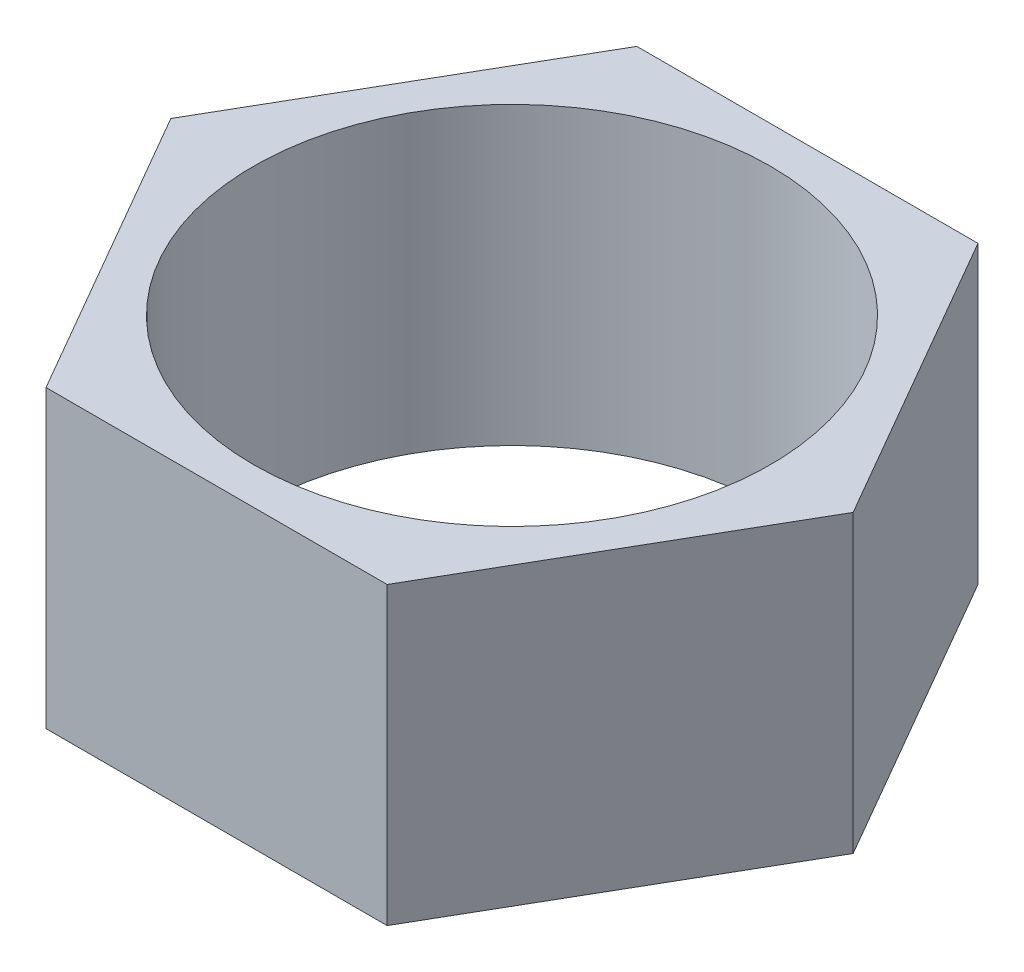
ISO-10303-21;
HEADER;
FILE_DESCRIPTION(('STEP AP214'),'2;1');
FILE_NAME('part.step','',(''),(''),'','','');
FILE_SCHEMA(('AUTOMOTIVE_DESIGN { 1 0 10303 214 1 1 1 1 }'));
ENDSEC;
DATA;
#1=APPLICATION_CONTEXT('core data for automotive mechanical design processes');
#2=APPLICATION_PROTOCOL_DEFINITION('international standard','automotive_design',2000,#1);
#3=PRODUCT_CONTEXT('',#1,'mechanical');
#4=PRODUCT('Part','Part','',(#3));
#5=PRODUCT_RELATED_PRODUCT_CATEGORY('part','',(#4));
#6=PRODUCT_DEFINITION_FORMATION('','',#4);
#7=PRODUCT_DEFINITION_CONTEXT('part definition',#1,'design');
#8=PRODUCT_DEFINITION('design','',#6,#7);
#9=PRODUCT_DEFINITION_SHAPE('','',#8);
#10=(LENGTH_UNIT() NAMED_UNIT(*) SI_UNIT(.MILLI.,.METRE.));
#11=(NAMED_UNIT(*) PLANE_ANGLE_UNIT() SI_UNIT($,.RADIAN.));
#12=(NAMED_UNIT(*) SI_UNIT($,.STERADIAN.) SOLID_ANGLE_UNIT());
#13=UNCERTAINTY_MEASURE_WITH_UNIT(LENGTH_MEASURE(1.E-05),#10,'distance_accuracy_value','');
#14=(GEOMETRIC_REPRESENTATION_CONTEXT(3) GLOBAL_UNCERTAINTY_ASSIGNED_CONTEXT((#13)) GLOBAL_UNIT_ASSIGNED_CONTEXT((#10,
#11,#12)) REPRESENTATION_CONTEXT('',''));
#15=CARTESIAN_POINT('',(0.,0.,0.));
#16=DIRECTION('',(0.,0.,1.));
#17=DIRECTION('',(1.,0.,0.));
#18=AXIS2_PLACEMENT_3D('',#15,#16,#17);
#19=CARTESIAN_POINT('',(0.,10.,0.));
#20=DIRECTION('',(0.,1.,0.));
#21=DIRECTION('',(0.,0.,1.));
#22=AXIS2_PLACEMENT_3D('',#19,#20,#21);
#23=PLANE('',#22);
#24=DIRECTION('',(0.5,0.,-0.866025403784439));
#25=VECTOR('',#24,1.);
#26=CARTESIAN_POINT('',(5.77350269189626,10.,10.));
#27=LINE('',#26,#25);
#28=CARTESIAN_POINT('',(5.77350269189626,10.,10.));
#29=VERTEX_POINT('',#28);
#30=CARTESIAN_POINT('',(11.5470053837925,10.,0.));
#31=VERTEX_POINT('',#30);
#32=EDGE_CURVE('E129',#29,#31,#27,.T.);
#33=ORIENTED_EDGE('',*,*,#32,.T.);
#34=DIRECTION('',(-0.5,0.,-0.866025403784438));
#35=VECTOR('',#34,1.);
#36=CARTESIAN_POINT('',(11.5470053837925,10.,0.));
#37=LINE('',#36,#35);
#38=CARTESIAN_POINT('',(5.77350269189626,10.,-10.));
#39=VERTEX_POINT('',#38);
#40=EDGE_CURVE('E87',#31,#39,#37,.T.);
#41=ORIENTED_EDGE('',*,*,#40,.T.);
#42=DIRECTION('',(-1.,0.,0.));
#43=VECTOR('',#42,1.);
#44=CARTESIAN_POINT('',(5.77350269189626,10.,-10.));
#45=LINE('',#44,#43);
#46=CARTESIAN_POINT('',(-5.77350269189626,10.,-10.));
#47=VERTEX_POINT('',#46);
#48=EDGE_CURVE('E100',#39,#47,#45,.T.);
#49=ORIENTED_EDGE('',*,*,#48,.T.);
#50=DIRECTION('',(-0.5,0.,0.866025403784439));
#51=VECTOR('',#50,1.);
#52=CARTESIAN_POINT('',(-5.77350269189626,10.,-10.));
#53=LINE('',#52,#51);
#54=CARTESIAN_POINT('',(-11.5470053837925,10.,0.));
#55=VERTEX_POINT('',#54);
#56=EDGE_CURVE('E94',#47,#55,#53,.T.);
#57=ORIENTED_EDGE('',*,*,#56,.T.);
#58=DIRECTION('',(0.5,0.,0.866025403784438));
#59=VECTOR('',#58,1.);
#60=CARTESIAN_POINT('',(-11.5470053837925,10.,0.));
#61=LINE('',#60,#59);
#62=CARTESIAN_POINT('',(-5.77350269189626,10.,10.));
#63=VERTEX_POINT('',#62);
#64=EDGE_CURVE('E98',#55,#63,#61,.T.);
#65=ORIENTED_EDGE('',*,*,#64,.T.);
#66=DIRECTION('',(1.,0.,0.));
#67=VECTOR('',#66,1.);
#68=CARTESIAN_POINT('',(-5.77350269189626,10.,10.));
#69=LINE('',#68,#67);
#70=EDGE_CURVE('E50',#63,#29,#69,.T.);
#71=ORIENTED_EDGE('',*,*,#70,.T.);
#72=EDGE_LOOP('',(#33,#41,#49,#57,#65,#71));
#73=FACE_BOUND('',#72,.T.);
#74=CARTESIAN_POINT('',(0.,10.,0.));
#75=DIRECTION('',(0.,1.,0.));
#76=DIRECTION('',(0.,0.,1.));
#77=AXIS2_PLACEMENT_3D('',#74,#75,#76);
#78=CIRCLE('',#77,8.75);
#79=CARTESIAN_POINT('',(0.,10.,8.75));
#80=VERTEX_POINT('',#79);
#81=EDGE_CURVE('E122',#80,#80,#78,.T.);
#82=ORIENTED_EDGE('',*,*,#81,.F.);
#83=EDGE_LOOP('',(#82));
#84=FACE_BOUND('',#83,.T.);
#85=ADVANCED_FACE('F33',(#73,#84),#23,.T.);
#86=CARTESIAN_POINT('',(0.,0.,0.));
#87=DIRECTION('',(0.,1.,0.));
#88=DIRECTION('',(0.,0.,1.));
#89=AXIS2_PLACEMENT_3D('',#86,#87,#88);
#90=PLANE('',#89);
#91=DIRECTION('',(0.5,0.,-0.866025403784439));
#92=VECTOR('',#91,1.);
#93=CARTESIAN_POINT('',(5.77350269189626,0.,10.));
#94=LINE('',#93,#92);
#95=CARTESIAN_POINT('',(5.77350269189626,0.,10.));
#96=VERTEX_POINT('',#95);
#97=CARTESIAN_POINT('',(11.5470053837925,0.,0.));
#98=VERTEX_POINT('',#97);
#99=EDGE_CURVE('E118',#96,#98,#94,.T.);
#100=ORIENTED_EDGE('',*,*,#99,.F.);
#101=DIRECTION('',(1.,0.,0.));
#102=VECTOR('',#101,1.);
#103=CARTESIAN_POINT('',(-5.77350269189626,0.,10.));
#104=LINE('',#103,#102);
#105=CARTESIAN_POINT('',(-5.77350269189626,0.,10.));
#106=VERTEX_POINT('',#105);
#107=EDGE_CURVE('E79',#106,#96,#104,.T.);
#108=ORIENTED_EDGE('',*,*,#107,.F.);
#109=DIRECTION('',(0.5,0.,0.866025403784438));
#110=VECTOR('',#109,1.);
#111=CARTESIAN_POINT('',(-11.5470053837925,0.,0.));
#112=LINE('',#111,#110);
#113=CARTESIAN_POINT('',(-11.5470053837925,0.,0.));
#114=VERTEX_POINT('',#113);
#115=EDGE_CURVE('E73',#114,#106,#112,.T.);
#116=ORIENTED_EDGE('',*,*,#115,.F.);
#117=DIRECTION('',(-0.5,0.,0.866025403784439));
#118=VECTOR('',#117,1.);
#119=CARTESIAN_POINT('',(-5.77350269189626,0.,-10.));
#120=LINE('',#119,#118);
#121=CARTESIAN_POINT('',(-5.77350269189626,0.,-10.));
#122=VERTEX_POINT('',#121);
#123=EDGE_CURVE('E108',#122,#114,#120,.T.);
#124=ORIENTED_EDGE('',*,*,#123,.F.);
#125=DIRECTION('',(-1.,0.,0.));
#126=VECTOR('',#125,1.);
#127=CARTESIAN_POINT('',(5.77350269189626,0.,-10.));
#128=LINE('',#127,#126);
#129=CARTESIAN_POINT('',(5.77350269189626,0.,-10.));
#130=VERTEX_POINT('',#129);
#131=EDGE_CURVE('E124',#130,#122,#128,.T.);
#132=ORIENTED_EDGE('',*,*,#131,.F.);
#133=DIRECTION('',(-0.5,0.,-0.866025403784438));
#134=VECTOR('',#133,1.);
#135=CARTESIAN_POINT('',(11.5470053837925,0.,0.));
#136=LINE('',#135,#134);
#137=EDGE_CURVE('E121',#98,#130,#136,.T.);
#138=ORIENTED_EDGE('',*,*,#137,.F.);
#139=EDGE_LOOP('',(#100,#108,#116,#124,#132,#138));
#140=FACE_BOUND('',#139,.T.);
#141=CARTESIAN_POINT('',(0.,0.,0.));
#142=DIRECTION('',(0.,1.,0.));
#143=DIRECTION('',(0.,0.,1.));
#144=AXIS2_PLACEMENT_3D('',#141,#142,#143);
#145=CIRCLE('',#144,8.75);
#146=CARTESIAN_POINT('',(0.,0.,8.75));
#147=VERTEX_POINT('',#146);
#148=EDGE_CURVE('E222',#147,#147,#145,.T.);
#149=ORIENTED_EDGE('',*,*,#148,.T.);
#150=EDGE_LOOP('',(#149));
#151=FACE_BOUND('',#150,.T.);
#152=ADVANCED_FACE('F138',(#140,#151),#90,.F.);
#153=CARTESIAN_POINT('',(5.77350269189626,10.,10.));
#154=DIRECTION('',(-0.866025403784439,0.,-0.5));
#155=DIRECTION('',(-0.5,0.,0.866025403784439));
#156=AXIS2_PLACEMENT_3D('',#153,#154,#155);
#157=PLANE('',#156);
#158=ORIENTED_EDGE('',*,*,#99,.T.);
#159=DIRECTION('',(0.,-1.,0.));
#160=VECTOR('',#159,1.);
#161=CARTESIAN_POINT('',(11.5470053837925,10.,0.));
#162=LINE('',#161,#160);
#163=EDGE_CURVE('E11',#31,#98,#162,.T.);
#164=ORIENTED_EDGE('',*,*,#163,.F.);
#165=ORIENTED_EDGE('',*,*,#32,.F.);
#166=DIRECTION('',(0.,-1.,0.));
#167=VECTOR('',#166,1.);
#168=CARTESIAN_POINT('',(5.77350269189626,10.,10.));
#169=LINE('',#168,#167);
#170=EDGE_CURVE('E114',#29,#96,#169,.T.);
#171=ORIENTED_EDGE('',*,*,#170,.T.);
#172=EDGE_LOOP('',(#158,#164,#165,#171));
#173=FACE_BOUND('',#172,.T.);
#174=ADVANCED_FACE('F35',(#173),#157,.F.);
#175=CARTESIAN_POINT('',(11.5470053837925,10.,0.));
#176=DIRECTION('',(-0.866025403784439,0.,0.5));
#177=DIRECTION('',(0.5,0.,0.866025403784439));
#178=AXIS2_PLACEMENT_3D('',#175,#176,#177);
#179=PLANE('',#178);
#180=ORIENTED_EDGE('',*,*,#137,.T.);
#181=DIRECTION('',(0.,-1.,0.));
#182=VECTOR('',#181,1.);
#183=CARTESIAN_POINT('',(5.77350269189626,10.,-10.));
#184=LINE('',#183,#182);
#185=EDGE_CURVE('E42',#39,#130,#184,.T.);
#186=ORIENTED_EDGE('',*,*,#185,.F.);
#187=ORIENTED_EDGE('',*,*,#40,.F.);
#188=ORIENTED_EDGE('',*,*,#163,.T.);
#189=EDGE_LOOP('',(#180,#186,#187,#188));
#190=FACE_BOUND('',#189,.T.);
#191=ADVANCED_FACE('F163',(#190),#179,.F.);
#192=CARTESIAN_POINT('',(5.77350269189626,10.,-10.));
#193=DIRECTION('',(0.,0.,1.));
#194=DIRECTION('',(1.,0.,0.));
#195=AXIS2_PLACEMENT_3D('',#192,#193,#194);
#196=PLANE('',#195);
#197=ORIENTED_EDGE('',*,*,#131,.T.);
#198=DIRECTION('',(0.,-1.,0.));
#199=VECTOR('',#198,1.);
#200=CARTESIAN_POINT('',(-5.77350269189626,10.,-10.));
#201=LINE('',#200,#199);
#202=EDGE_CURVE('E109',#47,#122,#201,.T.);
#203=ORIENTED_EDGE('',*,*,#202,.F.);
#204=ORIENTED_EDGE('',*,*,#48,.F.);
#205=ORIENTED_EDGE('',*,*,#185,.T.);
#206=EDGE_LOOP('',(#197,#203,#204,#205));
#207=FACE_BOUND('',#206,.T.);
#208=ADVANCED_FACE('F135',(#207),#196,.F.);
#209=CARTESIAN_POINT('',(-5.77350269189626,10.,-10.));
#210=DIRECTION('',(0.866025403784439,0.,0.5));
#211=DIRECTION('',(0.5,0.,-0.866025403784439));
#212=AXIS2_PLACEMENT_3D('',#209,#210,#211);
#213=PLANE('',#212);
#214=ORIENTED_EDGE('',*,*,#123,.T.);
#215=DIRECTION('',(0.,-1.,0.));
#216=VECTOR('',#215,1.);
#217=CARTESIAN_POINT('',(-11.5470053837925,10.,0.));
#218=LINE('',#217,#216);
#219=EDGE_CURVE('E105',#55,#114,#218,.T.);
#220=ORIENTED_EDGE('',*,*,#219,.F.);
#221=ORIENTED_EDGE('',*,*,#56,.F.);
#222=ORIENTED_EDGE('',*,*,#202,.T.);
#223=EDGE_LOOP('',(#214,#220,#221,#222));
#224=FACE_BOUND('',#223,.T.);
#225=ADVANCED_FACE('F106',(#224),#213,.F.);
#226=CARTESIAN_POINT('',(-11.5470053837925,10.,0.));
#227=DIRECTION('',(0.866025403784439,0.,-0.5));
#228=DIRECTION('',(-0.5,0.,-0.866025403784439));
#229=AXIS2_PLACEMENT_3D('',#226,#227,#228);
#230=PLANE('',#229);
#231=ORIENTED_EDGE('',*,*,#115,.T.);
#232=DIRECTION('',(0.,-1.,0.));
#233=VECTOR('',#232,1.);
#234=CARTESIAN_POINT('',(-5.77350269189626,10.,10.));
#235=LINE('',#234,#233);
#236=EDGE_CURVE('E110',#63,#106,#235,.T.);
#237=ORIENTED_EDGE('',*,*,#236,.F.);
#238=ORIENTED_EDGE('',*,*,#64,.F.);
#239=ORIENTED_EDGE('',*,*,#219,.T.);
#240=EDGE_LOOP('',(#231,#237,#238,#239));
#241=FACE_BOUND('',#240,.T.);
#242=ADVANCED_FACE('F112',(#241),#230,.F.);
#243=CARTESIAN_POINT('',(-5.77350269189626,10.,10.));
#244=DIRECTION('',(0.,0.,-1.));
#245=DIRECTION('',(-1.,0.,0.));
#246=AXIS2_PLACEMENT_3D('',#243,#244,#245);
#247=PLANE('',#246);
#248=ORIENTED_EDGE('',*,*,#107,.T.);
#249=ORIENTED_EDGE('',*,*,#170,.F.);
#250=ORIENTED_EDGE('',*,*,#70,.F.);
#251=ORIENTED_EDGE('',*,*,#236,.T.);
#252=EDGE_LOOP('',(#248,#249,#250,#251));
#253=FACE_BOUND('',#252,.T.);
#254=ADVANCED_FACE('F143',(#253),#247,.F.);
#255=CARTESIAN_POINT('',(0.,10.,0.));
#256=DIRECTION('',(0.,-1.,0.));
#257=DIRECTION('',(0.,0.,-1.));
#258=AXIS2_PLACEMENT_3D('',#255,#256,#257);
#259=CYLINDRICAL_SURFACE('',#258,8.75);
#260=ORIENTED_EDGE('',*,*,#81,.T.);
#261=EDGE_LOOP('',(#260));
#262=FACE_BOUND('',#261,.T.);
#263=ORIENTED_EDGE('',*,*,#148,.F.);
#264=EDGE_LOOP('',(#263));
#265=FACE_BOUND('',#264,.T.);
#266=ADVANCED_FACE('F145',(#262,#265),#259,.F.);
#267=CLOSED_SHELL('',(#85,#152,#174,#191,#208,#225,#242,#254,#266));
#268=MANIFOLD_SOLID_BREP('B2',#267);
#269=ADVANCED_BREP_SHAPE_REPRESENTATION('',(#18,#268),#14);
#270=SHAPE_DEFINITION_REPRESENTATION(#9,#269);
ENDSEC;
END-ISO-10303-21;
